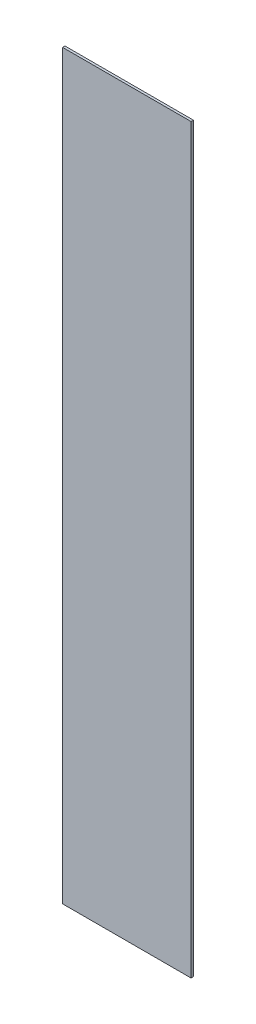
ISO-10303-21;
HEADER;
FILE_DESCRIPTION(('STEP AP214'),'2;1');
FILE_NAME('part.step','',(''),(''),'','','');
FILE_SCHEMA(('AUTOMOTIVE_DESIGN { 1 0 10303 214 1 1 1 1 }'));
ENDSEC;
DATA;
#1=APPLICATION_CONTEXT('core data for automotive mechanical design processes');
#2=APPLICATION_PROTOCOL_DEFINITION('international standard','automotive_design',2000,#1);
#3=PRODUCT_CONTEXT('',#1,'mechanical');
#4=PRODUCT('Part','Part','',(#3));
#5=PRODUCT_RELATED_PRODUCT_CATEGORY('part','',(#4));
#6=PRODUCT_DEFINITION_FORMATION('','',#4);
#7=PRODUCT_DEFINITION_CONTEXT('part definition',#1,'design');
#8=PRODUCT_DEFINITION('design','',#6,#7);
#9=PRODUCT_DEFINITION_SHAPE('','',#8);
#10=(LENGTH_UNIT() NAMED_UNIT(*) SI_UNIT(.MILLI.,.METRE.));
#11=(NAMED_UNIT(*) PLANE_ANGLE_UNIT() SI_UNIT($,.RADIAN.));
#12=(NAMED_UNIT(*) SI_UNIT($,.STERADIAN.) SOLID_ANGLE_UNIT());
#13=UNCERTAINTY_MEASURE_WITH_UNIT(LENGTH_MEASURE(1.E-05),#10,'distance_accuracy_value','');
#14=(GEOMETRIC_REPRESENTATION_CONTEXT(3) GLOBAL_UNCERTAINTY_ASSIGNED_CONTEXT((#13)) GLOBAL_UNIT_ASSIGNED_CONTEXT((#10,
#11,#12)) REPRESENTATION_CONTEXT('',''));
#15=CARTESIAN_POINT('',(0.,0.,0.));
#16=DIRECTION('',(0.,0.,1.));
#17=DIRECTION('',(1.,0.,0.));
#18=AXIS2_PLACEMENT_3D('',#15,#16,#17);
#19=CARTESIAN_POINT('',(135.,780.,5.));
#20=DIRECTION('',(-1.,0.,0.));
#21=DIRECTION('',(0.,-1.,0.));
#22=AXIS2_PLACEMENT_3D('',#19,#20,#21);
#23=PLANE('',#22);
#24=DIRECTION('',(0.,1.,0.));
#25=VECTOR('',#24,1.);
#26=CARTESIAN_POINT('',(135.,780.,0.));
#27=LINE('',#26,#25);
#28=CARTESIAN_POINT('',(135.,-780.,0.));
#29=VERTEX_POINT('',#28);
#30=CARTESIAN_POINT('',(135.,780.,0.));
#31=VERTEX_POINT('',#30);
#32=EDGE_CURVE('E96',#29,#31,#27,.T.);
#33=ORIENTED_EDGE('',*,*,#32,.T.);
#34=DIRECTION('',(0.,0.,-1.));
#35=VECTOR('',#34,1.);
#36=CARTESIAN_POINT('',(135.,780.,5.));
#37=LINE('',#36,#35);
#38=CARTESIAN_POINT('',(135.,780.,5.));
#39=VERTEX_POINT('',#38);
#40=EDGE_CURVE('E11',#39,#31,#37,.T.);
#41=ORIENTED_EDGE('',*,*,#40,.F.);
#42=DIRECTION('',(0.,1.,0.));
#43=VECTOR('',#42,1.);
#44=CARTESIAN_POINT('',(135.,780.,5.));
#45=LINE('',#44,#43);
#46=CARTESIAN_POINT('',(135.,-780.,5.));
#47=VERTEX_POINT('',#46);
#48=EDGE_CURVE('E84',#47,#39,#45,.T.);
#49=ORIENTED_EDGE('',*,*,#48,.F.);
#50=DIRECTION('',(0.,0.,-1.));
#51=VECTOR('',#50,1.);
#52=CARTESIAN_POINT('',(135.,-780.,5.));
#53=LINE('',#52,#51);
#54=EDGE_CURVE('E92',#47,#29,#53,.T.);
#55=ORIENTED_EDGE('',*,*,#54,.T.);
#56=EDGE_LOOP('',(#33,#41,#49,#55));
#57=FACE_BOUND('',#56,.T.);
#58=ADVANCED_FACE('F33',(#57),#23,.F.);
#59=CARTESIAN_POINT('',(-135.,780.,5.));
#60=DIRECTION('',(0.,-1.,0.));
#61=DIRECTION('',(1.,0.,0.));
#62=AXIS2_PLACEMENT_3D('',#59,#60,#61);
#63=PLANE('',#62);
#64=DIRECTION('',(-1.,0.,0.));
#65=VECTOR('',#64,1.);
#66=CARTESIAN_POINT('',(-135.,780.,0.));
#67=LINE('',#66,#65);
#68=CARTESIAN_POINT('',(-135.,780.,0.));
#69=VERTEX_POINT('',#68);
#70=EDGE_CURVE('E88',#31,#69,#67,.T.);
#71=ORIENTED_EDGE('',*,*,#70,.T.);
#72=DIRECTION('',(0.,0.,-1.));
#73=VECTOR('',#72,1.);
#74=CARTESIAN_POINT('',(-135.,780.,5.));
#75=LINE('',#74,#73);
#76=CARTESIAN_POINT('',(-135.,780.,5.));
#77=VERTEX_POINT('',#76);
#78=EDGE_CURVE('E41',#77,#69,#75,.T.);
#79=ORIENTED_EDGE('',*,*,#78,.F.);
#80=DIRECTION('',(-1.,0.,0.));
#81=VECTOR('',#80,1.);
#82=CARTESIAN_POINT('',(-135.,780.,5.));
#83=LINE('',#82,#81);
#84=EDGE_CURVE('E79',#39,#77,#83,.T.);
#85=ORIENTED_EDGE('',*,*,#84,.F.);
#86=ORIENTED_EDGE('',*,*,#40,.T.);
#87=EDGE_LOOP('',(#71,#79,#85,#86));
#88=FACE_BOUND('',#87,.T.);
#89=ADVANCED_FACE('F87',(#88),#63,.F.);
#90=CARTESIAN_POINT('',(-135.,780.,5.));
#91=DIRECTION('',(1.,0.,0.));
#92=DIRECTION('',(0.,1.,0.));
#93=AXIS2_PLACEMENT_3D('',#90,#91,#92);
#94=PLANE('',#93);
#95=DIRECTION('',(0.,-1.,0.));
#96=VECTOR('',#95,1.);
#97=CARTESIAN_POINT('',(-135.,780.,0.));
#98=LINE('',#97,#96);
#99=CARTESIAN_POINT('',(-135.,-780.,0.));
#100=VERTEX_POINT('',#99);
#101=EDGE_CURVE('E66',#69,#100,#98,.T.);
#102=ORIENTED_EDGE('',*,*,#101,.T.);
#103=DIRECTION('',(0.,0.,-1.));
#104=VECTOR('',#103,1.);
#105=CARTESIAN_POINT('',(-135.,-780.,5.));
#106=LINE('',#105,#104);
#107=CARTESIAN_POINT('',(-135.,-780.,5.));
#108=VERTEX_POINT('',#107);
#109=EDGE_CURVE('E89',#108,#100,#106,.T.);
#110=ORIENTED_EDGE('',*,*,#109,.F.);
#111=DIRECTION('',(0.,-1.,0.));
#112=VECTOR('',#111,1.);
#113=CARTESIAN_POINT('',(-135.,780.,5.));
#114=LINE('',#113,#112);
#115=EDGE_CURVE('E82',#77,#108,#114,.T.);
#116=ORIENTED_EDGE('',*,*,#115,.F.);
#117=ORIENTED_EDGE('',*,*,#78,.T.);
#118=EDGE_LOOP('',(#102,#110,#116,#117));
#119=FACE_BOUND('',#118,.T.);
#120=ADVANCED_FACE('F90',(#119),#94,.F.);
#121=CARTESIAN_POINT('',(-135.,-780.,5.));
#122=DIRECTION('',(0.,1.,0.));
#123=DIRECTION('',(0.,0.,1.));
#124=AXIS2_PLACEMENT_3D('',#121,#122,#123);
#125=PLANE('',#124);
#126=DIRECTION('',(1.,0.,0.));
#127=VECTOR('',#126,1.);
#128=CARTESIAN_POINT('',(-135.,-780.,0.));
#129=LINE('',#128,#127);
#130=EDGE_CURVE('E72',#100,#29,#129,.T.);
#131=ORIENTED_EDGE('',*,*,#130,.T.);
#132=ORIENTED_EDGE('',*,*,#54,.F.);
#133=DIRECTION('',(1.,0.,0.));
#134=VECTOR('',#133,1.);
#135=CARTESIAN_POINT('',(-135.,-780.,5.));
#136=LINE('',#135,#134);
#137=EDGE_CURVE('E49',#108,#47,#136,.T.);
#138=ORIENTED_EDGE('',*,*,#137,.F.);
#139=ORIENTED_EDGE('',*,*,#109,.T.);
#140=EDGE_LOOP('',(#131,#132,#138,#139));
#141=FACE_BOUND('',#140,.T.);
#142=ADVANCED_FACE('F103',(#141),#125,.F.);
#143=CARTESIAN_POINT('',(0.,0.,5.));
#144=DIRECTION('',(0.,0.,1.));
#145=DIRECTION('',(1.,0.,0.));
#146=AXIS2_PLACEMENT_3D('',#143,#144,#145);
#147=PLANE('',#146);
#148=ORIENTED_EDGE('',*,*,#48,.T.);
#149=ORIENTED_EDGE('',*,*,#84,.T.);
#150=ORIENTED_EDGE('',*,*,#115,.T.);
#151=ORIENTED_EDGE('',*,*,#137,.T.);
#152=EDGE_LOOP('',(#148,#149,#150,#151));
#153=FACE_BOUND('',#152,.T.);
#154=ADVANCED_FACE('F80',(#153),#147,.T.);
#155=CARTESIAN_POINT('',(0.,0.,0.));
#156=DIRECTION('',(0.,0.,1.));
#157=DIRECTION('',(1.,0.,0.));
#158=AXIS2_PLACEMENT_3D('',#155,#156,#157);
#159=PLANE('',#158);
#160=ORIENTED_EDGE('',*,*,#32,.F.);
#161=ORIENTED_EDGE('',*,*,#130,.F.);
#162=ORIENTED_EDGE('',*,*,#101,.F.);
#163=ORIENTED_EDGE('',*,*,#70,.F.);
#164=EDGE_LOOP('',(#160,#161,#162,#163));
#165=FACE_BOUND('',#164,.T.);
#166=ADVANCED_FACE('F106',(#165),#159,.F.);
#167=CLOSED_SHELL('',(#58,#89,#120,#142,#154,#166));
#168=MANIFOLD_SOLID_BREP('B2',#167);
#169=ADVANCED_BREP_SHAPE_REPRESENTATION('',(#18,#168),#14);
#170=SHAPE_DEFINITION_REPRESENTATION(#9,#169);
ENDSEC;
END-ISO-10303-21;
